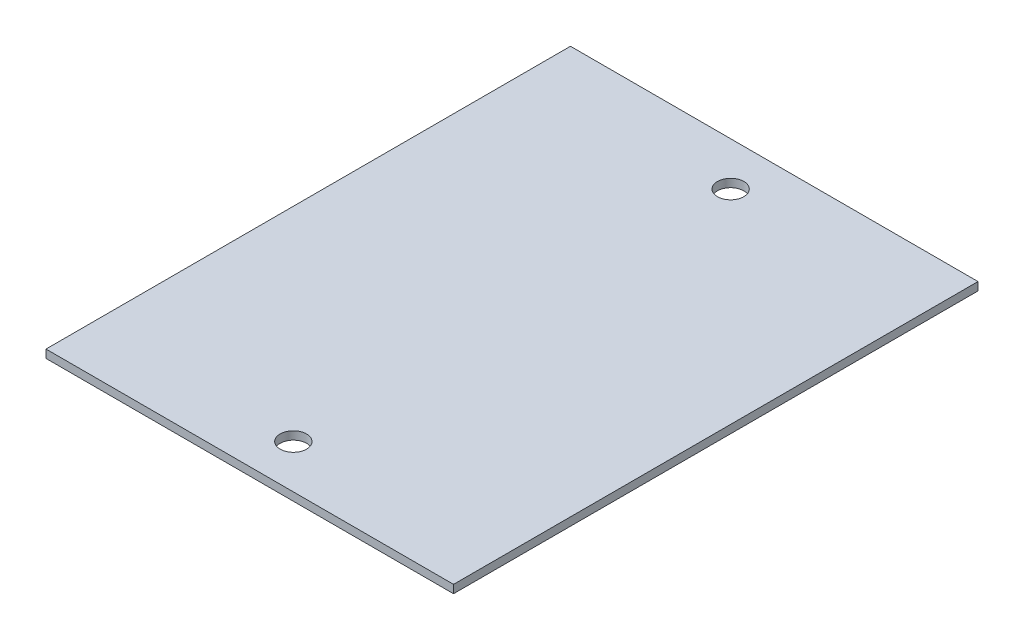
ISO-10303-21;
HEADER;
FILE_DESCRIPTION(('STEP AP214'),'2;1');
FILE_NAME('part.step','',(''),(''),'','','');
FILE_SCHEMA(('AUTOMOTIVE_DESIGN { 1 0 10303 214 1 1 1 1 }'));
ENDSEC;
DATA;
#1=APPLICATION_CONTEXT('core data for automotive mechanical design processes');
#2=APPLICATION_PROTOCOL_DEFINITION('international standard','automotive_design',2000,#1);
#3=PRODUCT_CONTEXT('',#1,'mechanical');
#4=PRODUCT('Part','Part','',(#3));
#5=PRODUCT_RELATED_PRODUCT_CATEGORY('part','',(#4));
#6=PRODUCT_DEFINITION_FORMATION('','',#4);
#7=PRODUCT_DEFINITION_CONTEXT('part definition',#1,'design');
#8=PRODUCT_DEFINITION('design','',#6,#7);
#9=PRODUCT_DEFINITION_SHAPE('','',#8);
#10=(LENGTH_UNIT() NAMED_UNIT(*) SI_UNIT(.MILLI.,.METRE.));
#11=(NAMED_UNIT(*) PLANE_ANGLE_UNIT() SI_UNIT($,.RADIAN.));
#12=(NAMED_UNIT(*) SI_UNIT($,.STERADIAN.) SOLID_ANGLE_UNIT());
#13=UNCERTAINTY_MEASURE_WITH_UNIT(LENGTH_MEASURE(1.E-05),#10,'distance_accuracy_value','');
#14=(GEOMETRIC_REPRESENTATION_CONTEXT(3) GLOBAL_UNCERTAINTY_ASSIGNED_CONTEXT((#13)) GLOBAL_UNIT_ASSIGNED_CONTEXT((#10,
#11,#12)) REPRESENTATION_CONTEXT('',''));
#15=CARTESIAN_POINT('',(0.,0.,0.));
#16=DIRECTION('',(0.,0.,1.));
#17=DIRECTION('',(1.,0.,0.));
#18=AXIS2_PLACEMENT_3D('',#15,#16,#17);
#19=CARTESIAN_POINT('',(0.,1.27,0.));
#20=DIRECTION('',(0.,1.,0.));
#21=DIRECTION('',(0.,0.,1.));
#22=AXIS2_PLACEMENT_3D('',#19,#20,#21);
#23=PLANE('',#22);
#24=CARTESIAN_POINT('',(0.,1.27,-34.06775));
#25=DIRECTION('',(0.,1.,0.));
#26=DIRECTION('',(0.,0.,1.));
#27=AXIS2_PLACEMENT_3D('',#24,#25,#26);
#28=CIRCLE('',#27,2.0574);
#29=CARTESIAN_POINT('',(0.,1.27,-32.01035));
#30=VERTEX_POINT('',#29);
#31=EDGE_CURVE('E100',#30,#30,#28,.T.);
#32=ORIENTED_EDGE('',*,*,#31,.F.);
#33=EDGE_LOOP('',(#32));
#34=FACE_BOUND('',#33,.T.);
#35=DIRECTION('',(0.,0.,-1.));
#36=VECTOR('',#35,1.);
#37=CARTESIAN_POINT('',(31.75,1.27,-40.8592426065197));
#38=LINE('',#37,#36);
#39=CARTESIAN_POINT('',(31.75,1.27,40.8592426065197));
#40=VERTEX_POINT('',#39);
#41=CARTESIAN_POINT('',(31.75,1.27,-40.8592426065197));
#42=VERTEX_POINT('',#41);
#43=EDGE_CURVE('E85',#40,#42,#38,.T.);
#44=ORIENTED_EDGE('',*,*,#43,.T.);
#45=DIRECTION('',(-1.,0.,0.));
#46=VECTOR('',#45,1.);
#47=CARTESIAN_POINT('',(-31.75,1.27,-40.8592426065197));
#48=LINE('',#47,#46);
#49=CARTESIAN_POINT('',(-31.75,1.27,-40.8592426065197));
#50=VERTEX_POINT('',#49);
#51=EDGE_CURVE('E80',#42,#50,#48,.T.);
#52=ORIENTED_EDGE('',*,*,#51,.T.);
#53=DIRECTION('',(0.,0.,1.));
#54=VECTOR('',#53,1.);
#55=CARTESIAN_POINT('',(-31.75,1.27,-40.8592426065197));
#56=LINE('',#55,#54);
#57=CARTESIAN_POINT('',(-31.75,1.27,40.8592426065197));
#58=VERTEX_POINT('',#57);
#59=EDGE_CURVE('E83',#50,#58,#56,.T.);
#60=ORIENTED_EDGE('',*,*,#59,.T.);
#61=DIRECTION('',(1.,0.,0.));
#62=VECTOR('',#61,1.);
#63=CARTESIAN_POINT('',(-31.75,1.27,40.8592426065197));
#64=LINE('',#63,#62);
#65=EDGE_CURVE('E50',#58,#40,#64,.T.);
#66=ORIENTED_EDGE('',*,*,#65,.T.);
#67=EDGE_LOOP('',(#44,#52,#60,#66));
#68=FACE_BOUND('',#67,.T.);
#69=CARTESIAN_POINT('',(0.,1.27,34.06775));
#70=DIRECTION('',(0.,1.,0.));
#71=DIRECTION('',(0.,0.,1.));
#72=AXIS2_PLACEMENT_3D('',#69,#70,#71);
#73=CIRCLE('',#72,2.0574);
#74=CARTESIAN_POINT('',(0.,1.27,36.12515));
#75=VERTEX_POINT('',#74);
#76=EDGE_CURVE('E115',#75,#75,#73,.T.);
#77=ORIENTED_EDGE('',*,*,#76,.F.);
#78=EDGE_LOOP('',(#77));
#79=FACE_BOUND('',#78,.T.);
#80=ADVANCED_FACE('F33',(#34,#68,#79),#23,.T.);
#81=CARTESIAN_POINT('',(0.,0.,0.));
#82=DIRECTION('',(0.,1.,0.));
#83=DIRECTION('',(0.,0.,1.));
#84=AXIS2_PLACEMENT_3D('',#81,#82,#83);
#85=PLANE('',#84);
#86=CARTESIAN_POINT('',(0.,0.,-34.06775));
#87=DIRECTION('',(0.,1.,0.));
#88=DIRECTION('',(0.,0.,1.));
#89=AXIS2_PLACEMENT_3D('',#86,#87,#88);
#90=CIRCLE('',#89,2.0574);
#91=CARTESIAN_POINT('',(0.,0.,-32.01035));
#92=VERTEX_POINT('',#91);
#93=EDGE_CURVE('E112',#92,#92,#90,.T.);
#94=ORIENTED_EDGE('',*,*,#93,.T.);
#95=EDGE_LOOP('',(#94));
#96=FACE_BOUND('',#95,.T.);
#97=DIRECTION('',(0.,0.,-1.));
#98=VECTOR('',#97,1.);
#99=CARTESIAN_POINT('',(31.75,0.,-40.8592426065197));
#100=LINE('',#99,#98);
#101=CARTESIAN_POINT('',(31.75,0.,40.8592426065197));
#102=VERTEX_POINT('',#101);
#103=CARTESIAN_POINT('',(31.75,0.,-40.8592426065197));
#104=VERTEX_POINT('',#103);
#105=EDGE_CURVE('E97',#102,#104,#100,.T.);
#106=ORIENTED_EDGE('',*,*,#105,.F.);
#107=DIRECTION('',(1.,0.,0.));
#108=VECTOR('',#107,1.);
#109=CARTESIAN_POINT('',(-31.75,0.,40.8592426065197));
#110=LINE('',#109,#108);
#111=CARTESIAN_POINT('',(-31.75,0.,40.8592426065197));
#112=VERTEX_POINT('',#111);
#113=EDGE_CURVE('E73',#112,#102,#110,.T.);
#114=ORIENTED_EDGE('',*,*,#113,.F.);
#115=DIRECTION('',(0.,0.,1.));
#116=VECTOR('',#115,1.);
#117=CARTESIAN_POINT('',(-31.75,0.,-40.8592426065197));
#118=LINE('',#117,#116);
#119=CARTESIAN_POINT('',(-31.75,0.,-40.8592426065197));
#120=VERTEX_POINT('',#119);
#121=EDGE_CURVE('E67',#120,#112,#118,.T.);
#122=ORIENTED_EDGE('',*,*,#121,.F.);
#123=DIRECTION('',(-1.,0.,0.));
#124=VECTOR('',#123,1.);
#125=CARTESIAN_POINT('',(-31.75,0.,-40.8592426065197));
#126=LINE('',#125,#124);
#127=EDGE_CURVE('E89',#104,#120,#126,.T.);
#128=ORIENTED_EDGE('',*,*,#127,.F.);
#129=EDGE_LOOP('',(#106,#114,#122,#128));
#130=FACE_BOUND('',#129,.T.);
#131=CARTESIAN_POINT('',(0.,0.,34.06775));
#132=DIRECTION('',(0.,1.,0.));
#133=DIRECTION('',(0.,0.,1.));
#134=AXIS2_PLACEMENT_3D('',#131,#132,#133);
#135=CIRCLE('',#134,2.0574);
#136=CARTESIAN_POINT('',(0.,0.,36.12515));
#137=VERTEX_POINT('',#136);
#138=EDGE_CURVE('E118',#137,#137,#135,.T.);
#139=ORIENTED_EDGE('',*,*,#138,.T.);
#140=EDGE_LOOP('',(#139));
#141=FACE_BOUND('',#140,.T.);
#142=ADVANCED_FACE('F108',(#96,#130,#141),#85,.F.);
#143=CARTESIAN_POINT('',(31.75,1.27,-40.8592426065197));
#144=DIRECTION('',(-1.,0.,0.));
#145=DIRECTION('',(0.,0.,1.));
#146=AXIS2_PLACEMENT_3D('',#143,#144,#145);
#147=PLANE('',#146);
#148=ORIENTED_EDGE('',*,*,#105,.T.);
#149=DIRECTION('',(0.,-1.,0.));
#150=VECTOR('',#149,1.);
#151=CARTESIAN_POINT('',(31.75,1.27,-40.8592426065197));
#152=LINE('',#151,#150);
#153=EDGE_CURVE('E11',#42,#104,#152,.T.);
#154=ORIENTED_EDGE('',*,*,#153,.F.);
#155=ORIENTED_EDGE('',*,*,#43,.F.);
#156=DIRECTION('',(0.,-1.,0.));
#157=VECTOR('',#156,1.);
#158=CARTESIAN_POINT('',(31.75,1.27,40.8592426065197));
#159=LINE('',#158,#157);
#160=EDGE_CURVE('E93',#40,#102,#159,.T.);
#161=ORIENTED_EDGE('',*,*,#160,.T.);
#162=EDGE_LOOP('',(#148,#154,#155,#161));
#163=FACE_BOUND('',#162,.T.);
#164=ADVANCED_FACE('F35',(#163),#147,.F.);
#165=CARTESIAN_POINT('',(-31.75,1.27,-40.8592426065197));
#166=DIRECTION('',(0.,0.,1.));
#167=DIRECTION('',(1.,0.,0.));
#168=AXIS2_PLACEMENT_3D('',#165,#166,#167);
#169=PLANE('',#168);
#170=ORIENTED_EDGE('',*,*,#127,.T.);
#171=DIRECTION('',(0.,-1.,0.));
#172=VECTOR('',#171,1.);
#173=CARTESIAN_POINT('',(-31.75,1.27,-40.8592426065197));
#174=LINE('',#173,#172);
#175=EDGE_CURVE('E42',#50,#120,#174,.T.);
#176=ORIENTED_EDGE('',*,*,#175,.F.);
#177=ORIENTED_EDGE('',*,*,#51,.F.);
#178=ORIENTED_EDGE('',*,*,#153,.T.);
#179=EDGE_LOOP('',(#170,#176,#177,#178));
#180=FACE_BOUND('',#179,.T.);
#181=ADVANCED_FACE('F88',(#180),#169,.F.);
#182=CARTESIAN_POINT('',(-31.75,1.27,-40.8592426065197));
#183=DIRECTION('',(1.,0.,0.));
#184=DIRECTION('',(0.,0.,-1.));
#185=AXIS2_PLACEMENT_3D('',#182,#183,#184);
#186=PLANE('',#185);
#187=ORIENTED_EDGE('',*,*,#121,.T.);
#188=DIRECTION('',(0.,-1.,0.));
#189=VECTOR('',#188,1.);
#190=CARTESIAN_POINT('',(-31.75,1.27,40.8592426065197));
#191=LINE('',#190,#189);
#192=EDGE_CURVE('E90',#58,#112,#191,.T.);
#193=ORIENTED_EDGE('',*,*,#192,.F.);
#194=ORIENTED_EDGE('',*,*,#59,.F.);
#195=ORIENTED_EDGE('',*,*,#175,.T.);
#196=EDGE_LOOP('',(#187,#193,#194,#195));
#197=FACE_BOUND('',#196,.T.);
#198=ADVANCED_FACE('F91',(#197),#186,.F.);
#199=CARTESIAN_POINT('',(-31.75,1.27,40.8592426065197));
#200=DIRECTION('',(0.,0.,-1.));
#201=DIRECTION('',(-1.,0.,0.));
#202=AXIS2_PLACEMENT_3D('',#199,#200,#201);
#203=PLANE('',#202);
#204=ORIENTED_EDGE('',*,*,#113,.T.);
#205=ORIENTED_EDGE('',*,*,#160,.F.);
#206=ORIENTED_EDGE('',*,*,#65,.F.);
#207=ORIENTED_EDGE('',*,*,#192,.T.);
#208=EDGE_LOOP('',(#204,#205,#206,#207));
#209=FACE_BOUND('',#208,.T.);
#210=ADVANCED_FACE('F105',(#209),#203,.F.);
#211=CARTESIAN_POINT('',(0.,1.27,-34.06775));
#212=DIRECTION('',(0.,-1.,0.));
#213=DIRECTION('',(0.,0.,-1.));
#214=AXIS2_PLACEMENT_3D('',#211,#212,#213);
#215=CYLINDRICAL_SURFACE('',#214,2.0574);
#216=ORIENTED_EDGE('',*,*,#31,.T.);
#217=EDGE_LOOP('',(#216));
#218=FACE_BOUND('',#217,.T.);
#219=ORIENTED_EDGE('',*,*,#93,.F.);
#220=EDGE_LOOP('',(#219));
#221=FACE_BOUND('',#220,.T.);
#222=ADVANCED_FACE('F136',(#218,#221),#215,.F.);
#223=CARTESIAN_POINT('',(0.,1.27,34.06775));
#224=DIRECTION('',(0.,-1.,0.));
#225=DIRECTION('',(0.,0.,-1.));
#226=AXIS2_PLACEMENT_3D('',#223,#224,#225);
#227=CYLINDRICAL_SURFACE('',#226,2.0574);
#228=ORIENTED_EDGE('',*,*,#76,.T.);
#229=EDGE_LOOP('',(#228));
#230=FACE_BOUND('',#229,.T.);
#231=ORIENTED_EDGE('',*,*,#138,.F.);
#232=EDGE_LOOP('',(#231));
#233=FACE_BOUND('',#232,.T.);
#234=ADVANCED_FACE('F124',(#230,#233),#227,.F.);
#235=CLOSED_SHELL('',(#80,#142,#164,#181,#198,#210,#222,#234));
#236=MANIFOLD_SOLID_BREP('B2',#235);
#237=ADVANCED_BREP_SHAPE_REPRESENTATION('',(#18,#236),#14);
#238=SHAPE_DEFINITION_REPRESENTATION(#9,#237);
ENDSEC;
END-ISO-10303-21;
